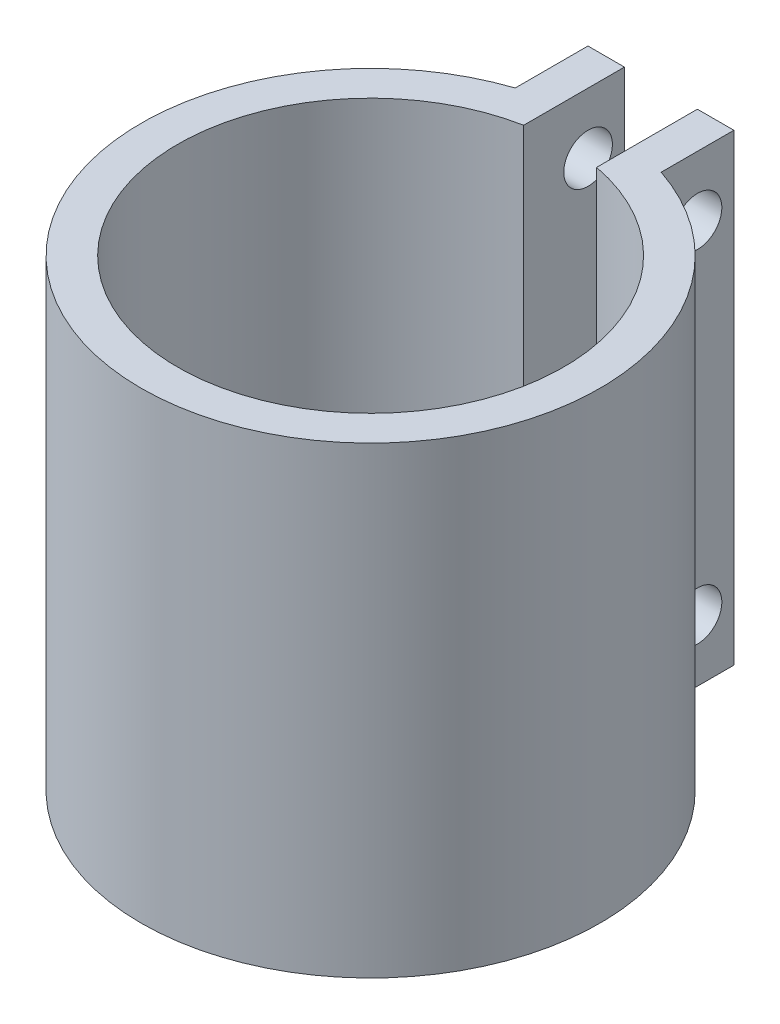
ISO-10303-21;
HEADER;
FILE_DESCRIPTION(('STEP AP214'),'2;1');
FILE_NAME('part.step','',(''),(''),'','','');
FILE_SCHEMA(('AUTOMOTIVE_DESIGN { 1 0 10303 214 1 1 1 1 }'));
ENDSEC;
DATA;
#1=APPLICATION_CONTEXT('core data for automotive mechanical design processes');
#2=APPLICATION_PROTOCOL_DEFINITION('international standard','automotive_design',2000,#1);
#3=PRODUCT_CONTEXT('',#1,'mechanical');
#4=PRODUCT('Part','Part','',(#3));
#5=PRODUCT_RELATED_PRODUCT_CATEGORY('part','',(#4));
#6=PRODUCT_DEFINITION_FORMATION('','',#4);
#7=PRODUCT_DEFINITION_CONTEXT('part definition',#1,'design');
#8=PRODUCT_DEFINITION('design','',#6,#7);
#9=PRODUCT_DEFINITION_SHAPE('','',#8);
#10=(LENGTH_UNIT() NAMED_UNIT(*) SI_UNIT(.MILLI.,.METRE.));
#11=(NAMED_UNIT(*) PLANE_ANGLE_UNIT() SI_UNIT($,.RADIAN.));
#12=(NAMED_UNIT(*) SI_UNIT($,.STERADIAN.) SOLID_ANGLE_UNIT());
#13=UNCERTAINTY_MEASURE_WITH_UNIT(LENGTH_MEASURE(1.E-05),#10,'distance_accuracy_value','');
#14=(GEOMETRIC_REPRESENTATION_CONTEXT(3) GLOBAL_UNCERTAINTY_ASSIGNED_CONTEXT((#13)) GLOBAL_UNIT_ASSIGNED_CONTEXT((#10,
#11,#12)) REPRESENTATION_CONTEXT('',''));
#15=CARTESIAN_POINT('',(0.,0.,0.));
#16=DIRECTION('',(0.,0.,1.));
#17=DIRECTION('',(1.,0.,0.));
#18=AXIS2_PLACEMENT_3D('',#15,#16,#17);
#19=CARTESIAN_POINT('',(0.,38.1,0.));
#20=DIRECTION('',(0.,-1.,0.));
#21=DIRECTION('',(0.,0.,-1.));
#22=AXIS2_PLACEMENT_3D('',#19,#20,#21);
#23=CYLINDRICAL_SURFACE('',#22,18.875);
#24=CARTESIAN_POINT('',(0.,0.,0.));
#25=DIRECTION('',(0.,1.,0.));
#26=DIRECTION('',(0.,0.,1.));
#27=AXIS2_PLACEMENT_3D('',#24,#25,#26);
#28=CIRCLE('',#27,18.875);
#29=CARTESIAN_POINT('',(-6.,0.,-17.8959667243768));
#30=VERTEX_POINT('',#29);
#31=CARTESIAN_POINT('',(6.,0.,-17.8959667243768));
#32=VERTEX_POINT('',#31);
#33=EDGE_CURVE('E141',#30,#32,#28,.T.);
#34=ORIENTED_EDGE('',*,*,#33,.T.);
#35=DIRECTION('',(0.,-1.,0.));
#36=VECTOR('',#35,1.);
#37=CARTESIAN_POINT('',(6.,38.1,-17.8959667243768));
#38=LINE('',#37,#36);
#39=CARTESIAN_POINT('',(6.,38.1,-17.8959667243768));
#40=VERTEX_POINT('',#39);
#41=EDGE_CURVE('E11',#40,#32,#38,.T.);
#42=ORIENTED_EDGE('',*,*,#41,.F.);
#43=CARTESIAN_POINT('',(0.,38.1,0.));
#44=DIRECTION('',(0.,1.,0.));
#45=DIRECTION('',(0.,0.,1.));
#46=AXIS2_PLACEMENT_3D('',#43,#44,#45);
#47=CIRCLE('',#46,18.875);
#48=CARTESIAN_POINT('',(-6.,38.1,-17.8959667243768));
#49=VERTEX_POINT('',#48);
#50=EDGE_CURVE('E158',#49,#40,#47,.T.);
#51=ORIENTED_EDGE('',*,*,#50,.F.);
#52=DIRECTION('',(0.,-1.,0.));
#53=VECTOR('',#52,1.);
#54=CARTESIAN_POINT('',(-6.,38.1,-17.8959667243768));
#55=LINE('',#54,#53);
#56=EDGE_CURVE('E137',#49,#30,#55,.T.);
#57=ORIENTED_EDGE('',*,*,#56,.T.);
#58=EDGE_LOOP('',(#34,#42,#51,#57));
#59=FACE_BOUND('',#58,.T.);
#60=ADVANCED_FACE('F37',(#59),#23,.T.);
#61=CARTESIAN_POINT('',(6.,38.1,-17.8959667243768));
#62=DIRECTION('',(-1.,0.,0.));
#63=DIRECTION('',(0.,0.,1.));
#64=AXIS2_PLACEMENT_3D('',#61,#62,#63);
#65=PLANE('',#64);
#66=CARTESIAN_POINT('',(6.,33.1,-20.8854833621884));
#67=DIRECTION('',(-1.,0.,0.));
#68=DIRECTION('',(0.,0.,1.));
#69=AXIS2_PLACEMENT_3D('',#66,#67,#68);
#70=CIRCLE('',#69,2.);
#71=CARTESIAN_POINT('',(6.,33.1,-18.8854833621884));
#72=VERTEX_POINT('',#71);
#73=EDGE_CURVE('E145',#72,#72,#70,.T.);
#74=ORIENTED_EDGE('',*,*,#73,.T.);
#75=EDGE_LOOP('',(#74));
#76=FACE_BOUND('',#75,.T.);
#77=CARTESIAN_POINT('',(6.,5.,-20.8854833621884));
#78=DIRECTION('',(-1.,0.,0.));
#79=DIRECTION('',(0.,0.,1.));
#80=AXIS2_PLACEMENT_3D('',#77,#78,#79);
#81=CIRCLE('',#80,2.);
#82=CARTESIAN_POINT('',(6.,5.,-18.8854833621884));
#83=VERTEX_POINT('',#82);
#84=EDGE_CURVE('E203',#83,#83,#81,.T.);
#85=ORIENTED_EDGE('',*,*,#84,.T.);
#86=EDGE_LOOP('',(#85));
#87=FACE_BOUND('',#86,.T.);
#88=DIRECTION('',(0.,0.,-1.));
#89=VECTOR('',#88,1.);
#90=CARTESIAN_POINT('',(6.,0.,-17.8959667243768));
#91=LINE('',#90,#89);
#92=CARTESIAN_POINT('',(6.,0.,-23.875));
#93=VERTEX_POINT('',#92);
#94=EDGE_CURVE('E144',#32,#93,#91,.T.);
#95=ORIENTED_EDGE('',*,*,#94,.T.);
#96=DIRECTION('',(0.,-1.,0.));
#97=VECTOR('',#96,1.);
#98=CARTESIAN_POINT('',(6.,38.1,-23.875));
#99=LINE('',#98,#97);
#100=CARTESIAN_POINT('',(6.,38.1,-23.875));
#101=VERTEX_POINT('',#100);
#102=EDGE_CURVE('E45',#101,#93,#99,.T.);
#103=ORIENTED_EDGE('',*,*,#102,.F.);
#104=DIRECTION('',(0.,0.,-1.));
#105=VECTOR('',#104,1.);
#106=CARTESIAN_POINT('',(6.,38.1,-17.8959667243768));
#107=LINE('',#106,#105);
#108=EDGE_CURVE('E98',#40,#101,#107,.T.);
#109=ORIENTED_EDGE('',*,*,#108,.F.);
#110=ORIENTED_EDGE('',*,*,#41,.T.);
#111=EDGE_LOOP('',(#95,#103,#109,#110));
#112=FACE_BOUND('',#111,.T.);
#113=ADVANCED_FACE('F246',(#76,#87,#112),#65,.F.);
#114=CARTESIAN_POINT('',(6.,38.1,-23.875));
#115=DIRECTION('',(0.,0.,1.));
#116=DIRECTION('',(1.,0.,0.));
#117=AXIS2_PLACEMENT_3D('',#114,#115,#116);
#118=PLANE('',#117);
#119=DIRECTION('',(-1.,0.,0.));
#120=VECTOR('',#119,1.);
#121=CARTESIAN_POINT('',(6.,0.,-23.875));
#122=LINE('',#121,#120);
#123=CARTESIAN_POINT('',(3.,0.,-23.875));
#124=VERTEX_POINT('',#123);
#125=EDGE_CURVE('E147',#93,#124,#122,.T.);
#126=ORIENTED_EDGE('',*,*,#125,.T.);
#127=DIRECTION('',(0.,-1.,0.));
#128=VECTOR('',#127,1.);
#129=CARTESIAN_POINT('',(3.,38.1,-23.875));
#130=LINE('',#129,#128);
#131=CARTESIAN_POINT('',(3.,38.1,-23.875));
#132=VERTEX_POINT('',#131);
#133=EDGE_CURVE('E167',#132,#124,#130,.T.);
#134=ORIENTED_EDGE('',*,*,#133,.F.);
#135=DIRECTION('',(-1.,0.,0.));
#136=VECTOR('',#135,1.);
#137=CARTESIAN_POINT('',(6.,38.1,-23.875));
#138=LINE('',#137,#136);
#139=EDGE_CURVE('E175',#101,#132,#138,.T.);
#140=ORIENTED_EDGE('',*,*,#139,.F.);
#141=ORIENTED_EDGE('',*,*,#102,.T.);
#142=EDGE_LOOP('',(#126,#134,#140,#141));
#143=FACE_BOUND('',#142,.T.);
#144=ADVANCED_FACE('F173',(#143),#118,.F.);
#145=CARTESIAN_POINT('',(3.,38.1,-15.875));
#146=DIRECTION('',(1.,0.,0.));
#147=DIRECTION('',(0.,0.,-1.));
#148=AXIS2_PLACEMENT_3D('',#145,#146,#147);
#149=PLANE('',#148);
#150=CARTESIAN_POINT('',(3.,33.1,-20.8854833621884));
#151=DIRECTION('',(1.,0.,0.));
#152=DIRECTION('',(0.,0.,-1.));
#153=AXIS2_PLACEMENT_3D('',#150,#151,#152);
#154=CIRCLE('',#153,2.);
#155=CARTESIAN_POINT('',(3.,33.1,-18.8854833621884));
#156=VERTEX_POINT('',#155);
#157=EDGE_CURVE('E197',#156,#156,#154,.T.);
#158=ORIENTED_EDGE('',*,*,#157,.T.);
#159=EDGE_LOOP('',(#158));
#160=FACE_BOUND('',#159,.T.);
#161=CARTESIAN_POINT('',(3.,5.,-20.8854833621884));
#162=DIRECTION('',(1.,0.,0.));
#163=DIRECTION('',(0.,0.,-1.));
#164=AXIS2_PLACEMENT_3D('',#161,#162,#163);
#165=CIRCLE('',#164,2.);
#166=CARTESIAN_POINT('',(3.,5.,-18.8854833621884));
#167=VERTEX_POINT('',#166);
#168=EDGE_CURVE('E206',#167,#167,#165,.T.);
#169=ORIENTED_EDGE('',*,*,#168,.T.);
#170=EDGE_LOOP('',(#169));
#171=FACE_BOUND('',#170,.T.);
#172=DIRECTION('',(0.,0.,1.));
#173=VECTOR('',#172,1.);
#174=CARTESIAN_POINT('',(3.,0.,-15.875));
#175=LINE('',#174,#173);
#176=CARTESIAN_POINT('',(3.,0.,-15.5889584321724));
#177=VERTEX_POINT('',#176);
#178=EDGE_CURVE('E150',#124,#177,#175,.T.);
#179=ORIENTED_EDGE('',*,*,#178,.T.);
#180=DIRECTION('',(0.,-1.,0.));
#181=VECTOR('',#180,1.);
#182=CARTESIAN_POINT('',(3.,38.1,-15.5889584321724));
#183=LINE('',#182,#181);
#184=CARTESIAN_POINT('',(3.,38.1,-15.5889584321724));
#185=VERTEX_POINT('',#184);
#186=EDGE_CURVE('E164',#185,#177,#183,.T.);
#187=ORIENTED_EDGE('',*,*,#186,.F.);
#188=DIRECTION('',(0.,0.,1.));
#189=VECTOR('',#188,1.);
#190=CARTESIAN_POINT('',(3.,38.1,-15.875));
#191=LINE('',#190,#189);
#192=EDGE_CURVE('E187',#132,#185,#191,.T.);
#193=ORIENTED_EDGE('',*,*,#192,.F.);
#194=ORIENTED_EDGE('',*,*,#133,.T.);
#195=EDGE_LOOP('',(#179,#187,#193,#194));
#196=FACE_BOUND('',#195,.T.);
#197=ADVANCED_FACE('F182',(#160,#171,#196),#149,.F.);
#198=CARTESIAN_POINT('',(0.,38.1,0.));
#199=DIRECTION('',(0.,-1.,0.));
#200=DIRECTION('',(0.,0.,-1.));
#201=AXIS2_PLACEMENT_3D('',#198,#199,#200);
#202=CYLINDRICAL_SURFACE('',#201,15.875);
#203=CARTESIAN_POINT('',(0.,0.,0.));
#204=DIRECTION('',(0.,-1.,0.));
#205=DIRECTION('',(0.,0.,1.));
#206=AXIS2_PLACEMENT_3D('',#203,#204,#205);
#207=CIRCLE('',#206,15.875);
#208=CARTESIAN_POINT('',(-3.,0.,-15.5889584321724));
#209=VERTEX_POINT('',#208);
#210=EDGE_CURVE('E152',#177,#209,#207,.T.);
#211=ORIENTED_EDGE('',*,*,#210,.T.);
#212=DIRECTION('',(0.,-1.,0.));
#213=VECTOR('',#212,1.);
#214=CARTESIAN_POINT('',(-3.,38.1,-15.5889584321724));
#215=LINE('',#214,#213);
#216=CARTESIAN_POINT('',(-3.,38.1,-15.5889584321724));
#217=VERTEX_POINT('',#216);
#218=EDGE_CURVE('E129',#217,#209,#215,.T.);
#219=ORIENTED_EDGE('',*,*,#218,.F.);
#220=CARTESIAN_POINT('',(0.,38.1,0.));
#221=DIRECTION('',(0.,-1.,0.));
#222=DIRECTION('',(0.,0.,1.));
#223=AXIS2_PLACEMENT_3D('',#220,#221,#222);
#224=CIRCLE('',#223,15.875);
#225=EDGE_CURVE('E119',#185,#217,#224,.T.);
#226=ORIENTED_EDGE('',*,*,#225,.F.);
#227=ORIENTED_EDGE('',*,*,#186,.T.);
#228=EDGE_LOOP('',(#211,#219,#226,#227));
#229=FACE_BOUND('',#228,.T.);
#230=ADVANCED_FACE('F185',(#229),#202,.F.);
#231=CARTESIAN_POINT('',(-3.,38.1,-15.875));
#232=DIRECTION('',(-1.,0.,0.));
#233=DIRECTION('',(0.,0.,1.));
#234=AXIS2_PLACEMENT_3D('',#231,#232,#233);
#235=PLANE('',#234);
#236=CARTESIAN_POINT('',(-3.,33.1,-20.8854833621884));
#237=DIRECTION('',(-1.,0.,0.));
#238=DIRECTION('',(0.,0.,1.));
#239=AXIS2_PLACEMENT_3D('',#236,#237,#238);
#240=CIRCLE('',#239,2.);
#241=CARTESIAN_POINT('',(-3.,33.1,-18.8854833621884));
#242=VERTEX_POINT('',#241);
#243=EDGE_CURVE('E200',#242,#242,#240,.T.);
#244=ORIENTED_EDGE('',*,*,#243,.T.);
#245=EDGE_LOOP('',(#244));
#246=FACE_BOUND('',#245,.T.);
#247=CARTESIAN_POINT('',(-3.,5.,-20.8854833621884));
#248=DIRECTION('',(-1.,0.,0.));
#249=DIRECTION('',(0.,0.,1.));
#250=AXIS2_PLACEMENT_3D('',#247,#248,#249);
#251=CIRCLE('',#250,2.);
#252=CARTESIAN_POINT('',(-3.,5.,-18.8854833621884));
#253=VERTEX_POINT('',#252);
#254=EDGE_CURVE('E209',#253,#253,#251,.T.);
#255=ORIENTED_EDGE('',*,*,#254,.T.);
#256=EDGE_LOOP('',(#255));
#257=FACE_BOUND('',#256,.T.);
#258=DIRECTION('',(0.,0.,-1.));
#259=VECTOR('',#258,1.);
#260=CARTESIAN_POINT('',(-3.,0.,-15.875));
#261=LINE('',#260,#259);
#262=CARTESIAN_POINT('',(-3.,0.,-23.875));
#263=VERTEX_POINT('',#262);
#264=EDGE_CURVE('E127',#209,#263,#261,.T.);
#265=ORIENTED_EDGE('',*,*,#264,.T.);
#266=DIRECTION('',(0.,-1.,0.));
#267=VECTOR('',#266,1.);
#268=CARTESIAN_POINT('',(-3.,38.1,-23.875));
#269=LINE('',#268,#267);
#270=CARTESIAN_POINT('',(-3.,38.1,-23.875));
#271=VERTEX_POINT('',#270);
#272=EDGE_CURVE('E125',#271,#263,#269,.T.);
#273=ORIENTED_EDGE('',*,*,#272,.F.);
#274=DIRECTION('',(0.,0.,-1.));
#275=VECTOR('',#274,1.);
#276=CARTESIAN_POINT('',(-3.,38.1,-15.875));
#277=LINE('',#276,#275);
#278=EDGE_CURVE('E113',#217,#271,#277,.T.);
#279=ORIENTED_EDGE('',*,*,#278,.F.);
#280=ORIENTED_EDGE('',*,*,#218,.T.);
#281=EDGE_LOOP('',(#265,#273,#279,#280));
#282=FACE_BOUND('',#281,.T.);
#283=ADVANCED_FACE('F126',(#246,#257,#282),#235,.F.);
#284=CARTESIAN_POINT('',(-3.,38.1,-23.875));
#285=DIRECTION('',(0.,0.,1.));
#286=DIRECTION('',(1.,0.,0.));
#287=AXIS2_PLACEMENT_3D('',#284,#285,#286);
#288=PLANE('',#287);
#289=DIRECTION('',(-1.,0.,0.));
#290=VECTOR('',#289,1.);
#291=CARTESIAN_POINT('',(-3.,0.,-23.875));
#292=LINE('',#291,#290);
#293=CARTESIAN_POINT('',(-6.,0.,-23.875));
#294=VERTEX_POINT('',#293);
#295=EDGE_CURVE('E84',#263,#294,#292,.T.);
#296=ORIENTED_EDGE('',*,*,#295,.T.);
#297=DIRECTION('',(0.,-1.,0.));
#298=VECTOR('',#297,1.);
#299=CARTESIAN_POINT('',(-6.,38.1,-23.875));
#300=LINE('',#299,#298);
#301=CARTESIAN_POINT('',(-6.,38.1,-23.875));
#302=VERTEX_POINT('',#301);
#303=EDGE_CURVE('E130',#302,#294,#300,.T.);
#304=ORIENTED_EDGE('',*,*,#303,.F.);
#305=DIRECTION('',(-1.,0.,0.));
#306=VECTOR('',#305,1.);
#307=CARTESIAN_POINT('',(-3.,38.1,-23.875));
#308=LINE('',#307,#306);
#309=EDGE_CURVE('E117',#271,#302,#308,.T.);
#310=ORIENTED_EDGE('',*,*,#309,.F.);
#311=ORIENTED_EDGE('',*,*,#272,.T.);
#312=EDGE_LOOP('',(#296,#304,#310,#311));
#313=FACE_BOUND('',#312,.T.);
#314=ADVANCED_FACE('F132',(#313),#288,.F.);
#315=CARTESIAN_POINT('',(-6.,38.1,-17.8959667243768));
#316=DIRECTION('',(1.,0.,0.));
#317=DIRECTION('',(0.,0.,-1.));
#318=AXIS2_PLACEMENT_3D('',#315,#316,#317);
#319=PLANE('',#318);
#320=CARTESIAN_POINT('',(-6.,33.1,-20.8854833621884));
#321=DIRECTION('',(-1.,0.,0.));
#322=DIRECTION('',(0.,0.,1.));
#323=AXIS2_PLACEMENT_3D('',#320,#321,#322);
#324=CIRCLE('',#323,2.);
#325=CARTESIAN_POINT('',(-6.,33.1,-18.8854833621884));
#326=VERTEX_POINT('',#325);
#327=EDGE_CURVE('E212',#326,#326,#324,.T.);
#328=ORIENTED_EDGE('',*,*,#327,.F.);
#329=EDGE_LOOP('',(#328));
#330=FACE_BOUND('',#329,.T.);
#331=CARTESIAN_POINT('',(-6.,5.,-20.8854833621884));
#332=DIRECTION('',(-1.,0.,0.));
#333=DIRECTION('',(0.,0.,1.));
#334=AXIS2_PLACEMENT_3D('',#331,#332,#333);
#335=CIRCLE('',#334,2.);
#336=CARTESIAN_POINT('',(-6.,5.,-18.8854833621884));
#337=VERTEX_POINT('',#336);
#338=EDGE_CURVE('E213',#337,#337,#335,.T.);
#339=ORIENTED_EDGE('',*,*,#338,.F.);
#340=EDGE_LOOP('',(#339));
#341=FACE_BOUND('',#340,.T.);
#342=DIRECTION('',(0.,0.,1.));
#343=VECTOR('',#342,1.);
#344=CARTESIAN_POINT('',(-6.,0.,-17.8959667243768));
#345=LINE('',#344,#343);
#346=EDGE_CURVE('E90',#294,#30,#345,.T.);
#347=ORIENTED_EDGE('',*,*,#346,.T.);
#348=ORIENTED_EDGE('',*,*,#56,.F.);
#349=DIRECTION('',(0.,0.,1.));
#350=VECTOR('',#349,1.);
#351=CARTESIAN_POINT('',(-6.,38.1,-17.8959667243768));
#352=LINE('',#351,#350);
#353=EDGE_CURVE('E55',#302,#49,#352,.T.);
#354=ORIENTED_EDGE('',*,*,#353,.F.);
#355=ORIENTED_EDGE('',*,*,#303,.T.);
#356=EDGE_LOOP('',(#347,#348,#354,#355));
#357=FACE_BOUND('',#356,.T.);
#358=ADVANCED_FACE('F223',(#330,#341,#357),#319,.F.);
#359=CARTESIAN_POINT('',(0.,38.1,0.));
#360=DIRECTION('',(0.,1.,0.));
#361=DIRECTION('',(0.,0.,1.));
#362=AXIS2_PLACEMENT_3D('',#359,#360,#361);
#363=PLANE('',#362);
#364=ORIENTED_EDGE('',*,*,#50,.T.);
#365=ORIENTED_EDGE('',*,*,#108,.T.);
#366=ORIENTED_EDGE('',*,*,#139,.T.);
#367=ORIENTED_EDGE('',*,*,#192,.T.);
#368=ORIENTED_EDGE('',*,*,#225,.T.);
#369=ORIENTED_EDGE('',*,*,#278,.T.);
#370=ORIENTED_EDGE('',*,*,#309,.T.);
#371=ORIENTED_EDGE('',*,*,#353,.T.);
#372=EDGE_LOOP('',(#364,#365,#366,#367,#368,#369,#370,#371));
#373=FACE_BOUND('',#372,.T.);
#374=ADVANCED_FACE('F115',(#373),#363,.T.);
#375=CARTESIAN_POINT('',(0.,0.,0.));
#376=DIRECTION('',(0.,1.,0.));
#377=DIRECTION('',(0.,0.,1.));
#378=AXIS2_PLACEMENT_3D('',#375,#376,#377);
#379=PLANE('',#378);
#380=ORIENTED_EDGE('',*,*,#33,.F.);
#381=ORIENTED_EDGE('',*,*,#346,.F.);
#382=ORIENTED_EDGE('',*,*,#295,.F.);
#383=ORIENTED_EDGE('',*,*,#264,.F.);
#384=ORIENTED_EDGE('',*,*,#210,.F.);
#385=ORIENTED_EDGE('',*,*,#178,.F.);
#386=ORIENTED_EDGE('',*,*,#125,.F.);
#387=ORIENTED_EDGE('',*,*,#94,.F.);
#388=EDGE_LOOP('',(#380,#381,#382,#383,#384,#385,#386,#387));
#389=FACE_BOUND('',#388,.T.);
#390=ADVANCED_FACE('F178',(#389),#379,.F.);
#391=CARTESIAN_POINT('',(18.875,5.,-20.8854833621884));
#392=DIRECTION('',(-1.,0.,0.));
#393=DIRECTION('',(0.,0.,1.));
#394=AXIS2_PLACEMENT_3D('',#391,#392,#393);
#395=CYLINDRICAL_SURFACE('',#394,2.);
#396=ORIENTED_EDGE('',*,*,#338,.T.);
#397=EDGE_LOOP('',(#396));
#398=FACE_BOUND('',#397,.T.);
#399=ORIENTED_EDGE('',*,*,#254,.F.);
#400=EDGE_LOOP('',(#399));
#401=FACE_BOUND('',#400,.T.);
#402=ADVANCED_FACE('F229',(#398,#401),#395,.F.);
#403=CARTESIAN_POINT('',(18.875,33.1,-20.8854833621884));
#404=DIRECTION('',(-1.,0.,0.));
#405=DIRECTION('',(0.,0.,1.));
#406=AXIS2_PLACEMENT_3D('',#403,#404,#405);
#407=CYLINDRICAL_SURFACE('',#406,2.);
#408=ORIENTED_EDGE('',*,*,#327,.T.);
#409=EDGE_LOOP('',(#408));
#410=FACE_BOUND('',#409,.T.);
#411=ORIENTED_EDGE('',*,*,#243,.F.);
#412=EDGE_LOOP('',(#411));
#413=FACE_BOUND('',#412,.T.);
#414=ADVANCED_FACE('F220',(#410,#413),#407,.F.);
#415=CARTESIAN_POINT('',(3.,5.,-18.8854833621884));
#416=CARTESIAN_POINT('',(3.03125,5.,-18.8854833621884));
#417=CARTESIAN_POINT('',(3.0625,5.,-18.8854833621884));
#418=CARTESIAN_POINT('',(3.125,5.,-18.8854833621884));
#419=CARTESIAN_POINT('',(3.15625,5.,-18.8854833621884));
#420=CARTESIAN_POINT('',(3.21875,5.,-18.8854833621884));
#421=CARTESIAN_POINT('',(3.25,5.,-18.8854833621884));
#422=CARTESIAN_POINT('',(3.3125,5.,-18.8854833621884));
#423=CARTESIAN_POINT('',(3.34375,5.,-18.8854833621884));
#424=CARTESIAN_POINT('',(3.40625,5.,-18.8854833621884));
#425=CARTESIAN_POINT('',(3.4375,5.,-18.8854833621884));
#426=CARTESIAN_POINT('',(3.5,5.,-18.8854833621884));
#427=CARTESIAN_POINT('',(3.53125,5.,-18.8854833621884));
#428=CARTESIAN_POINT('',(3.59375,5.,-18.8854833621884));
#429=CARTESIAN_POINT('',(3.625,5.,-18.8854833621884));
#430=CARTESIAN_POINT('',(3.6875,5.,-18.8854833621884));
#431=CARTESIAN_POINT('',(3.71875,5.,-18.8854833621884));
#432=CARTESIAN_POINT('',(3.78125,5.,-18.8854833621884));
#433=CARTESIAN_POINT('',(3.8125,5.,-18.8854833621884));
#434=CARTESIAN_POINT('',(3.875,5.,-18.8854833621884));
#435=CARTESIAN_POINT('',(3.90625,5.,-18.8854833621884));
#436=CARTESIAN_POINT('',(3.96875,5.,-18.8854833621884));
#437=CARTESIAN_POINT('',(4.,5.,-18.8854833621884));
#438=CARTESIAN_POINT('',(4.0625,5.,-18.8854833621884));
#439=CARTESIAN_POINT('',(4.09375,5.,-18.8854833621884));
#440=CARTESIAN_POINT('',(4.15625,5.,-18.8854833621884));
#441=CARTESIAN_POINT('',(4.1875,5.,-18.8854833621884));
#442=CARTESIAN_POINT('',(4.25,5.,-18.8854833621884));
#443=CARTESIAN_POINT('',(4.28125,5.,-18.8854833621884));
#444=CARTESIAN_POINT('',(4.34375,5.,-18.8854833621884));
#445=CARTESIAN_POINT('',(4.375,5.,-18.8854833621884));
#446=CARTESIAN_POINT('',(4.4375,5.,-18.8854833621884));
#447=CARTESIAN_POINT('',(4.46875,5.,-18.8854833621884));
#448=CARTESIAN_POINT('',(4.53125,5.,-18.8854833621884));
#449=CARTESIAN_POINT('',(4.5625,5.,-18.8854833621884));
#450=CARTESIAN_POINT('',(4.625,5.,-18.8854833621884));
#451=CARTESIAN_POINT('',(4.65625,5.,-18.8854833621884));
#452=CARTESIAN_POINT('',(4.71875,5.,-18.8854833621884));
#453=CARTESIAN_POINT('',(4.75,5.,-18.8854833621884));
#454=CARTESIAN_POINT('',(4.8125,5.,-18.8854833621884));
#455=CARTESIAN_POINT('',(4.84375,5.,-18.8854833621884));
#456=CARTESIAN_POINT('',(4.90625,5.,-18.8854833621884));
#457=CARTESIAN_POINT('',(4.9375,5.,-18.8854833621884));
#458=CARTESIAN_POINT('',(5.,5.,-18.8854833621884));
#459=CARTESIAN_POINT('',(5.03125,5.,-18.8854833621884));
#460=CARTESIAN_POINT('',(5.09375,5.,-18.8854833621884));
#461=CARTESIAN_POINT('',(5.125,5.,-18.8854833621884));
#462=CARTESIAN_POINT('',(5.1875,5.,-18.8854833621884));
#463=CARTESIAN_POINT('',(5.21875,5.,-18.8854833621884));
#464=CARTESIAN_POINT('',(5.28125,5.,-18.8854833621884));
#465=CARTESIAN_POINT('',(5.3125,5.,-18.8854833621884));
#466=CARTESIAN_POINT('',(5.375,5.,-18.8854833621884));
#467=CARTESIAN_POINT('',(5.40625,5.,-18.8854833621884));
#468=CARTESIAN_POINT('',(5.46875,5.,-18.8854833621884));
#469=CARTESIAN_POINT('',(5.5,5.,-18.8854833621884));
#470=CARTESIAN_POINT('',(5.5625,5.,-18.8854833621884));
#471=CARTESIAN_POINT('',(5.59375,5.,-18.8854833621884));
#472=CARTESIAN_POINT('',(5.65625,5.,-18.8854833621884));
#473=CARTESIAN_POINT('',(5.6875,5.,-18.8854833621884));
#474=CARTESIAN_POINT('',(5.75,5.,-18.8854833621884));
#475=CARTESIAN_POINT('',(5.78125,5.,-18.8854833621884));
#476=CARTESIAN_POINT('',(5.84375,5.,-18.8854833621884));
#477=CARTESIAN_POINT('',(5.875,5.,-18.8854833621884));
#478=CARTESIAN_POINT('',(5.9375,5.,-18.8854833621884));
#479=CARTESIAN_POINT('',(5.96875,5.,-18.8854833621884));
#480=CARTESIAN_POINT('',(6.,5.,-18.8854833621884));
#481=B_SPLINE_CURVE_WITH_KNOTS('',3,(#415,#416,#417,#418,#419,#420,#421,#422,#423,#424,#425,
#426,#427,#428,#429,#430,#431,#432,#433,#434,#435,#436,#437,#438,#439,#440,#441,#442,#443,#444,
#445,#446,#447,#448,#449,#450,#451,#452,#453,#454,#455,#456,#457,#458,#459,#460,#461,#462,#463,
#464,#465,#466,#467,#468,#469,#470,#471,#472,#473,#474,#475,#476,#477,#478,#479,#480),
.UNSPECIFIED.,.F.,.F.,(4,2,2,2,2,2,2,2,2,2,2,2,2,2,2,2,2,2,2,2,2,2,2,2,2,2,2,2,2,2,2,2,4),(0.,
0.0937500000000001,0.1875,0.28125,0.375,0.46875,0.5625,0.656250000000001,0.750000000000001,
0.843750000000002,0.937500000000003,1.03125,1.125,1.21875,1.3125,1.40625,1.5,1.59375,1.6875,
1.78125,1.875,1.96875,2.06250000000001,2.15625000000001,2.25000000000001,2.34375000000001,
2.43750000000001,2.53125000000001,2.62500000000001,2.71875000000001,2.81250000000001,
2.90625000000001,3.00000000000001),.UNSPECIFIED.);
#482=EDGE_CURVE('BSEAM233',#167,#83,#481,.T.);
#483=ORIENTED_EDGE('',*,*,#168,.F.);
#484=ORIENTED_EDGE('',*,*,#84,.F.);
#485=ORIENTED_EDGE('',*,*,#482,.T.);
#486=ORIENTED_EDGE('',*,*,#482,.F.);
#487=EDGE_LOOP('',(#483,#485,#484,#486));
#488=FACE_BOUND('',#487,.T.);
#489=ADVANCED_FACE('F233',(#488),#395,.F.);
#490=CARTESIAN_POINT('',(3.,33.1,-18.8854833621884));
#491=CARTESIAN_POINT('',(3.03125,33.1,-18.8854833621884));
#492=CARTESIAN_POINT('',(3.0625,33.1,-18.8854833621884));
#493=CARTESIAN_POINT('',(3.125,33.1,-18.8854833621884));
#494=CARTESIAN_POINT('',(3.15625,33.1,-18.8854833621884));
#495=CARTESIAN_POINT('',(3.21875,33.1,-18.8854833621884));
#496=CARTESIAN_POINT('',(3.25,33.1,-18.8854833621884));
#497=CARTESIAN_POINT('',(3.3125,33.1,-18.8854833621884));
#498=CARTESIAN_POINT('',(3.34375,33.1,-18.8854833621884));
#499=CARTESIAN_POINT('',(3.40625,33.1,-18.8854833621884));
#500=CARTESIAN_POINT('',(3.4375,33.1,-18.8854833621884));
#501=CARTESIAN_POINT('',(3.5,33.1,-18.8854833621884));
#502=CARTESIAN_POINT('',(3.53125,33.1,-18.8854833621884));
#503=CARTESIAN_POINT('',(3.59375,33.1,-18.8854833621884));
#504=CARTESIAN_POINT('',(3.625,33.1,-18.8854833621884));
#505=CARTESIAN_POINT('',(3.6875,33.1,-18.8854833621884));
#506=CARTESIAN_POINT('',(3.71875,33.1,-18.8854833621884));
#507=CARTESIAN_POINT('',(3.78125,33.1,-18.8854833621884));
#508=CARTESIAN_POINT('',(3.8125,33.1,-18.8854833621884));
#509=CARTESIAN_POINT('',(3.875,33.1,-18.8854833621884));
#510=CARTESIAN_POINT('',(3.90625,33.1,-18.8854833621884));
#511=CARTESIAN_POINT('',(3.96875,33.1,-18.8854833621884));
#512=CARTESIAN_POINT('',(4.,33.1,-18.8854833621884));
#513=CARTESIAN_POINT('',(4.0625,33.1,-18.8854833621884));
#514=CARTESIAN_POINT('',(4.09375,33.1,-18.8854833621884));
#515=CARTESIAN_POINT('',(4.15625,33.1,-18.8854833621884));
#516=CARTESIAN_POINT('',(4.1875,33.1,-18.8854833621884));
#517=CARTESIAN_POINT('',(4.25,33.1,-18.8854833621884));
#518=CARTESIAN_POINT('',(4.28125,33.1,-18.8854833621884));
#519=CARTESIAN_POINT('',(4.34375,33.1,-18.8854833621884));
#520=CARTESIAN_POINT('',(4.375,33.1,-18.8854833621884));
#521=CARTESIAN_POINT('',(4.4375,33.1,-18.8854833621884));
#522=CARTESIAN_POINT('',(4.46875,33.1,-18.8854833621884));
#523=CARTESIAN_POINT('',(4.53125,33.1,-18.8854833621884));
#524=CARTESIAN_POINT('',(4.5625,33.1,-18.8854833621884));
#525=CARTESIAN_POINT('',(4.625,33.1,-18.8854833621884));
#526=CARTESIAN_POINT('',(4.65625,33.1,-18.8854833621884));
#527=CARTESIAN_POINT('',(4.71875,33.1,-18.8854833621884));
#528=CARTESIAN_POINT('',(4.75,33.1,-18.8854833621884));
#529=CARTESIAN_POINT('',(4.8125,33.1,-18.8854833621884));
#530=CARTESIAN_POINT('',(4.84375,33.1,-18.8854833621884));
#531=CARTESIAN_POINT('',(4.90625,33.1,-18.8854833621884));
#532=CARTESIAN_POINT('',(4.9375,33.1,-18.8854833621884));
#533=CARTESIAN_POINT('',(5.,33.1,-18.8854833621884));
#534=CARTESIAN_POINT('',(5.03125,33.1,-18.8854833621884));
#535=CARTESIAN_POINT('',(5.09375,33.1,-18.8854833621884));
#536=CARTESIAN_POINT('',(5.125,33.1,-18.8854833621884));
#537=CARTESIAN_POINT('',(5.1875,33.1,-18.8854833621884));
#538=CARTESIAN_POINT('',(5.21875,33.1,-18.8854833621884));
#539=CARTESIAN_POINT('',(5.28125,33.1,-18.8854833621884));
#540=CARTESIAN_POINT('',(5.3125,33.1,-18.8854833621884));
#541=CARTESIAN_POINT('',(5.375,33.1,-18.8854833621884));
#542=CARTESIAN_POINT('',(5.40625,33.1,-18.8854833621884));
#543=CARTESIAN_POINT('',(5.46875,33.1,-18.8854833621884));
#544=CARTESIAN_POINT('',(5.5,33.1,-18.8854833621884));
#545=CARTESIAN_POINT('',(5.5625,33.1,-18.8854833621884));
#546=CARTESIAN_POINT('',(5.59375,33.1,-18.8854833621884));
#547=CARTESIAN_POINT('',(5.65625,33.1,-18.8854833621884));
#548=CARTESIAN_POINT('',(5.6875,33.1,-18.8854833621884));
#549=CARTESIAN_POINT('',(5.75,33.1,-18.8854833621884));
#550=CARTESIAN_POINT('',(5.78125,33.1,-18.8854833621884));
#551=CARTESIAN_POINT('',(5.84375,33.1,-18.8854833621884));
#552=CARTESIAN_POINT('',(5.875,33.1,-18.8854833621884));
#553=CARTESIAN_POINT('',(5.9375,33.1,-18.8854833621884));
#554=CARTESIAN_POINT('',(5.96875,33.1,-18.8854833621884));
#555=CARTESIAN_POINT('',(6.,33.1,-18.8854833621884));
#556=B_SPLINE_CURVE_WITH_KNOTS('',3,(#490,#491,#492,#493,#494,#495,#496,#497,#498,#499,#500,
#501,#502,#503,#504,#505,#506,#507,#508,#509,#510,#511,#512,#513,#514,#515,#516,#517,#518,#519,
#520,#521,#522,#523,#524,#525,#526,#527,#528,#529,#530,#531,#532,#533,#534,#535,#536,#537,#538,
#539,#540,#541,#542,#543,#544,#545,#546,#547,#548,#549,#550,#551,#552,#553,#554,#555),
.UNSPECIFIED.,.F.,.F.,(4,2,2,2,2,2,2,2,2,2,2,2,2,2,2,2,2,2,2,2,2,2,2,2,2,2,2,2,2,2,2,2,4),(0.,
0.0937500000000001,0.1875,0.28125,0.375,0.46875,0.5625,0.656250000000001,0.750000000000001,
0.843750000000002,0.937500000000003,1.03125,1.125,1.21875,1.3125,1.40625,1.5,1.59375,1.6875,
1.78125,1.875,1.96875,2.06250000000001,2.15625000000001,2.25000000000001,2.34375000000001,
2.43750000000001,2.53125000000001,2.62500000000001,2.71875000000001,2.81250000000001,
2.90625000000001,3.00000000000001),.UNSPECIFIED.);
#557=EDGE_CURVE('BSEAM270',#156,#72,#556,.T.);
#558=ORIENTED_EDGE('',*,*,#157,.F.);
#559=ORIENTED_EDGE('',*,*,#73,.F.);
#560=ORIENTED_EDGE('',*,*,#557,.T.);
#561=ORIENTED_EDGE('',*,*,#557,.F.);
#562=EDGE_LOOP('',(#558,#560,#559,#561));
#563=FACE_BOUND('',#562,.T.);
#564=ADVANCED_FACE('F270',(#563),#407,.F.);
#565=CLOSED_SHELL('',(#60,#113,#144,#197,#230,#283,#314,#358,#374,#390,#402,#414,#489,#564));
#566=MANIFOLD_SOLID_BREP('B2',#565);
#567=ADVANCED_BREP_SHAPE_REPRESENTATION('',(#18,#566),#14);
#568=SHAPE_DEFINITION_REPRESENTATION(#9,#567);
ENDSEC;
END-ISO-10303-21;
